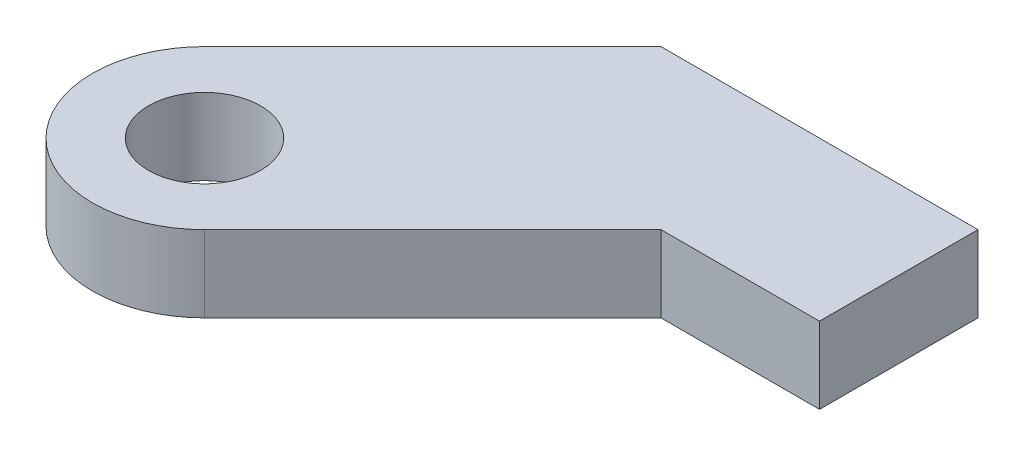
ISO-10303-21;
HEADER;
FILE_DESCRIPTION(('STEP AP214'),'2;1');
FILE_NAME('part.step','',(''),(''),'','','');
FILE_SCHEMA(('AUTOMOTIVE_DESIGN { 1 0 10303 214 1 1 1 1 }'));
ENDSEC;
DATA;
#1=APPLICATION_CONTEXT('core data for automotive mechanical design processes');
#2=APPLICATION_PROTOCOL_DEFINITION('international standard','automotive_design',2000,#1);
#3=PRODUCT_CONTEXT('',#1,'mechanical');
#4=PRODUCT('Part','Part','',(#3));
#5=PRODUCT_RELATED_PRODUCT_CATEGORY('part','',(#4));
#6=PRODUCT_DEFINITION_FORMATION('','',#4);
#7=PRODUCT_DEFINITION_CONTEXT('part definition',#1,'design');
#8=PRODUCT_DEFINITION('design','',#6,#7);
#9=PRODUCT_DEFINITION_SHAPE('','',#8);
#10=(LENGTH_UNIT() NAMED_UNIT(*) SI_UNIT(.MILLI.,.METRE.));
#11=(NAMED_UNIT(*) PLANE_ANGLE_UNIT() SI_UNIT($,.RADIAN.));
#12=(NAMED_UNIT(*) SI_UNIT($,.STERADIAN.) SOLID_ANGLE_UNIT());
#13=UNCERTAINTY_MEASURE_WITH_UNIT(LENGTH_MEASURE(1.E-05),#10,'distance_accuracy_value','');
#14=(GEOMETRIC_REPRESENTATION_CONTEXT(3) GLOBAL_UNCERTAINTY_ASSIGNED_CONTEXT((#13)) GLOBAL_UNIT_ASSIGNED_CONTEXT((#10,
#11,#12)) REPRESENTATION_CONTEXT('',''));
#15=CARTESIAN_POINT('',(0.,0.,0.));
#16=DIRECTION('',(0.,0.,1.));
#17=DIRECTION('',(1.,0.,0.));
#18=AXIS2_PLACEMENT_3D('',#15,#16,#17);
#19=CARTESIAN_POINT('',(-4.49719912834644,1.5,4.49719912834644));
#20=DIRECTION('',(0.,1.,0.));
#21=DIRECTION('',(0.,0.,1.));
#22=AXIS2_PLACEMENT_3D('',#19,#20,#21);
#23=PLANE('',#22);
#24=DIRECTION('',(-1.,0.,0.));
#25=VECTOR('',#24,1.);
#26=CARTESIAN_POINT('',(1.53795724908074,1.5,-1.53795724908074));
#27=LINE('',#26,#25);
#28=CARTESIAN_POINT('',(4.64922708630155,1.5,-1.53795724908074));
#29=VERTEX_POINT('',#28);
#30=CARTESIAN_POINT('',(-1.57331258814007,1.5,-1.53795724908074));
#31=VERTEX_POINT('',#30);
#32=EDGE_CURVE('E51',#29,#31,#27,.T.);
#33=ORIENTED_EDGE('',*,*,#32,.T.);
#34=DIRECTION('',(-0.707106781186547,0.,0.707106781186548));
#35=VECTOR('',#34,1.);
#36=CARTESIAN_POINT('',(-1.57331258814007,1.5,-1.53795724908074));
#37=LINE('',#36,#35);
#38=CARTESIAN_POINT('',(-6.05283404695685,1.5,2.94156420973604));
#39=VERTEX_POINT('',#38);
#40=EDGE_CURVE('E89',#31,#39,#37,.T.);
#41=ORIENTED_EDGE('',*,*,#40,.T.);
#42=CARTESIAN_POINT('',(-4.49719912834644,1.5,4.49719912834644));
#43=DIRECTION('',(0.,1.,0.));
#44=DIRECTION('',(0.,0.,1.));
#45=AXIS2_PLACEMENT_3D('',#42,#43,#44);
#46=CIRCLE('',#45,2.2);
#47=CARTESIAN_POINT('',(-2.94156420973604,1.5,6.05283404695685));
#48=VERTEX_POINT('',#47);
#49=EDGE_CURVE('E103',#39,#48,#46,.T.);
#50=ORIENTED_EDGE('',*,*,#49,.T.);
#51=DIRECTION('',(0.707106781186548,0.,-0.707106781186547));
#52=VECTOR('',#51,1.);
#53=CARTESIAN_POINT('',(1.53795724908074,1.5,1.57331258814007));
#54=LINE('',#53,#52);
#55=CARTESIAN_POINT('',(1.53795724908074,1.5,1.57331258814007));
#56=VERTEX_POINT('',#55);
#57=EDGE_CURVE('E97',#48,#56,#54,.T.);
#58=ORIENTED_EDGE('',*,*,#57,.T.);
#59=DIRECTION('',(1.,0.,0.));
#60=VECTOR('',#59,1.);
#61=CARTESIAN_POINT('',(1.53795724908074,1.5,1.57331258814007));
#62=LINE('',#61,#60);
#63=CARTESIAN_POINT('',(4.64922708630155,1.5,1.57331258814007));
#64=VERTEX_POINT('',#63);
#65=EDGE_CURVE('E101',#56,#64,#62,.T.);
#66=ORIENTED_EDGE('',*,*,#65,.T.);
#67=DIRECTION('',(0.,0.,-1.));
#68=VECTOR('',#67,1.);
#69=CARTESIAN_POINT('',(4.64922708630155,1.5,-1.53795724908074));
#70=LINE('',#69,#68);
#71=EDGE_CURVE('E117',#64,#29,#70,.T.);
#72=ORIENTED_EDGE('',*,*,#71,.T.);
#73=EDGE_LOOP('',(#33,#41,#50,#58,#66,#72));
#74=FACE_BOUND('',#73,.T.);
#75=CARTESIAN_POINT('',(-4.49719912834644,1.5,4.49719912834644));
#76=DIRECTION('',(0.,1.,0.));
#77=DIRECTION('',(0.,0.,1.));
#78=AXIS2_PLACEMENT_3D('',#75,#76,#77);
#79=CIRCLE('',#78,1.1);
#80=CARTESIAN_POINT('',(-4.49719912834644,1.5,5.59719912834644));
#81=VERTEX_POINT('',#80);
#82=EDGE_CURVE('E126',#81,#81,#79,.T.);
#83=ORIENTED_EDGE('',*,*,#82,.F.);
#84=EDGE_LOOP('',(#83));
#85=FACE_BOUND('',#84,.T.);
#86=ADVANCED_FACE('F34',(#74,#85),#23,.T.);
#87=CARTESIAN_POINT('',(-4.49719912834644,0.,4.49719912834644));
#88=DIRECTION('',(0.,1.,0.));
#89=DIRECTION('',(0.,0.,1.));
#90=AXIS2_PLACEMENT_3D('',#87,#88,#89);
#91=PLANE('',#90);
#92=DIRECTION('',(-0.707106781186547,0.,0.707106781186548));
#93=VECTOR('',#92,1.);
#94=CARTESIAN_POINT('',(-1.57331258814007,0.,-1.53795724908074));
#95=LINE('',#94,#93);
#96=CARTESIAN_POINT('',(-1.57331258814007,0.,-1.53795724908074));
#97=VERTEX_POINT('',#96);
#98=CARTESIAN_POINT('',(-6.05283404695685,0.,2.94156420973604));
#99=VERTEX_POINT('',#98);
#100=EDGE_CURVE('E123',#97,#99,#95,.T.);
#101=ORIENTED_EDGE('',*,*,#100,.F.);
#102=DIRECTION('',(-1.,0.,0.));
#103=VECTOR('',#102,1.);
#104=CARTESIAN_POINT('',(1.53795724908074,0.,-1.53795724908074));
#105=LINE('',#104,#103);
#106=CARTESIAN_POINT('',(4.64922708630155,0.,-1.53795724908074));
#107=VERTEX_POINT('',#106);
#108=EDGE_CURVE('E131',#107,#97,#105,.T.);
#109=ORIENTED_EDGE('',*,*,#108,.F.);
#110=DIRECTION('',(0.,0.,-1.));
#111=VECTOR('',#110,1.);
#112=CARTESIAN_POINT('',(4.64922708630155,0.,-1.53795724908074));
#113=LINE('',#112,#111);
#114=CARTESIAN_POINT('',(4.64922708630155,0.,1.57331258814007));
#115=VERTEX_POINT('',#114);
#116=EDGE_CURVE('E82',#115,#107,#113,.T.);
#117=ORIENTED_EDGE('',*,*,#116,.F.);
#118=DIRECTION('',(1.,0.,0.));
#119=VECTOR('',#118,1.);
#120=CARTESIAN_POINT('',(1.53795724908074,0.,1.57331258814007));
#121=LINE('',#120,#119);
#122=CARTESIAN_POINT('',(1.53795724908074,0.,1.57331258814007));
#123=VERTEX_POINT('',#122);
#124=EDGE_CURVE('E75',#123,#115,#121,.T.);
#125=ORIENTED_EDGE('',*,*,#124,.F.);
#126=DIRECTION('',(0.707106781186548,0.,-0.707106781186547));
#127=VECTOR('',#126,1.);
#128=CARTESIAN_POINT('',(1.53795724908074,0.,1.57331258814007));
#129=LINE('',#128,#127);
#130=CARTESIAN_POINT('',(-2.94156420973604,0.,6.05283404695685));
#131=VERTEX_POINT('',#130);
#132=EDGE_CURVE('E111',#131,#123,#129,.T.);
#133=ORIENTED_EDGE('',*,*,#132,.F.);
#134=CARTESIAN_POINT('',(-4.49719912834644,0.,4.49719912834644));
#135=DIRECTION('',(0.,1.,0.));
#136=DIRECTION('',(0.,0.,1.));
#137=AXIS2_PLACEMENT_3D('',#134,#135,#136);
#138=CIRCLE('',#137,2.2);
#139=EDGE_CURVE('E125',#99,#131,#138,.T.);
#140=ORIENTED_EDGE('',*,*,#139,.F.);
#141=EDGE_LOOP('',(#101,#109,#117,#125,#133,#140));
#142=FACE_BOUND('',#141,.T.);
#143=CARTESIAN_POINT('',(-4.49719912834644,0.,4.49719912834644));
#144=DIRECTION('',(0.,1.,0.));
#145=DIRECTION('',(0.,0.,1.));
#146=AXIS2_PLACEMENT_3D('',#143,#144,#145);
#147=CIRCLE('',#146,1.1);
#148=CARTESIAN_POINT('',(-4.49719912834644,0.,5.59719912834644));
#149=VERTEX_POINT('',#148);
#150=EDGE_CURVE('E149',#149,#149,#147,.T.);
#151=ORIENTED_EDGE('',*,*,#150,.T.);
#152=EDGE_LOOP('',(#151));
#153=FACE_BOUND('',#152,.T.);
#154=ADVANCED_FACE('F141',(#142,#153),#91,.F.);
#155=CARTESIAN_POINT('',(-1.57331258814007,1.5,-1.53795724908074));
#156=DIRECTION('',(0.707106781186548,0.,0.707106781186547));
#157=DIRECTION('',(0.707106781186547,0.,-0.707106781186548));
#158=AXIS2_PLACEMENT_3D('',#155,#156,#157);
#159=PLANE('',#158);
#160=ORIENTED_EDGE('',*,*,#100,.T.);
#161=DIRECTION('',(0.,-1.,0.));
#162=VECTOR('',#161,1.);
#163=CARTESIAN_POINT('',(-6.05283404695685,1.5,2.94156420973604));
#164=LINE('',#163,#162);
#165=EDGE_CURVE('E43',#39,#99,#164,.T.);
#166=ORIENTED_EDGE('',*,*,#165,.F.);
#167=ORIENTED_EDGE('',*,*,#40,.F.);
#168=DIRECTION('',(0.,-1.,0.));
#169=VECTOR('',#168,1.);
#170=CARTESIAN_POINT('',(-1.57331258814007,1.5,-1.53795724908074));
#171=LINE('',#170,#169);
#172=EDGE_CURVE('E11',#31,#97,#171,.T.);
#173=ORIENTED_EDGE('',*,*,#172,.T.);
#174=EDGE_LOOP('',(#160,#166,#167,#173));
#175=FACE_BOUND('',#174,.T.);
#176=ADVANCED_FACE('F36',(#175),#159,.F.);
#177=CARTESIAN_POINT('',(-4.49719912834644,1.5,4.49719912834644));
#178=DIRECTION('',(0.,-1.,0.));
#179=DIRECTION('',(0.,0.,-1.));
#180=AXIS2_PLACEMENT_3D('',#177,#178,#179);
#181=CYLINDRICAL_SURFACE('',#180,2.2);
#182=ORIENTED_EDGE('',*,*,#139,.T.);
#183=DIRECTION('',(0.,-1.,0.));
#184=VECTOR('',#183,1.);
#185=CARTESIAN_POINT('',(-2.94156420973604,1.5,6.05283404695685));
#186=LINE('',#185,#184);
#187=EDGE_CURVE('E112',#48,#131,#186,.T.);
#188=ORIENTED_EDGE('',*,*,#187,.F.);
#189=ORIENTED_EDGE('',*,*,#49,.F.);
#190=ORIENTED_EDGE('',*,*,#165,.T.);
#191=EDGE_LOOP('',(#182,#188,#189,#190));
#192=FACE_BOUND('',#191,.T.);
#193=ADVANCED_FACE('F138',(#192),#181,.T.);
#194=CARTESIAN_POINT('',(1.53795724908074,1.5,1.57331258814007));
#195=DIRECTION('',(-0.707106781186547,0.,-0.707106781186548));
#196=DIRECTION('',(-0.707106781186548,0.,0.707106781186547));
#197=AXIS2_PLACEMENT_3D('',#194,#195,#196);
#198=PLANE('',#197);
#199=ORIENTED_EDGE('',*,*,#132,.T.);
#200=DIRECTION('',(0.,-1.,0.));
#201=VECTOR('',#200,1.);
#202=CARTESIAN_POINT('',(1.53795724908074,1.5,1.57331258814007));
#203=LINE('',#202,#201);
#204=EDGE_CURVE('E108',#56,#123,#203,.T.);
#205=ORIENTED_EDGE('',*,*,#204,.F.);
#206=ORIENTED_EDGE('',*,*,#57,.F.);
#207=ORIENTED_EDGE('',*,*,#187,.T.);
#208=EDGE_LOOP('',(#199,#205,#206,#207));
#209=FACE_BOUND('',#208,.T.);
#210=ADVANCED_FACE('F109',(#209),#198,.F.);
#211=CARTESIAN_POINT('',(1.53795724908074,1.5,1.57331258814007));
#212=DIRECTION('',(0.,0.,-1.));
#213=DIRECTION('',(-1.,0.,0.));
#214=AXIS2_PLACEMENT_3D('',#211,#212,#213);
#215=PLANE('',#214);
#216=ORIENTED_EDGE('',*,*,#124,.T.);
#217=DIRECTION('',(0.,-1.,0.));
#218=VECTOR('',#217,1.);
#219=CARTESIAN_POINT('',(4.64922708630155,1.5,1.57331258814007));
#220=LINE('',#219,#218);
#221=EDGE_CURVE('E113',#64,#115,#220,.T.);
#222=ORIENTED_EDGE('',*,*,#221,.F.);
#223=ORIENTED_EDGE('',*,*,#65,.F.);
#224=ORIENTED_EDGE('',*,*,#204,.T.);
#225=EDGE_LOOP('',(#216,#222,#223,#224));
#226=FACE_BOUND('',#225,.T.);
#227=ADVANCED_FACE('F115',(#226),#215,.F.);
#228=CARTESIAN_POINT('',(4.64922708630155,1.5,-1.53795724908074));
#229=DIRECTION('',(-1.,0.,0.));
#230=DIRECTION('',(0.,0.,1.));
#231=AXIS2_PLACEMENT_3D('',#228,#229,#230);
#232=PLANE('',#231);
#233=ORIENTED_EDGE('',*,*,#116,.T.);
#234=DIRECTION('',(0.,-1.,0.));
#235=VECTOR('',#234,1.);
#236=CARTESIAN_POINT('',(4.64922708630155,1.5,-1.53795724908074));
#237=LINE('',#236,#235);
#238=EDGE_CURVE('E119',#29,#107,#237,.T.);
#239=ORIENTED_EDGE('',*,*,#238,.F.);
#240=ORIENTED_EDGE('',*,*,#71,.F.);
#241=ORIENTED_EDGE('',*,*,#221,.T.);
#242=EDGE_LOOP('',(#233,#239,#240,#241));
#243=FACE_BOUND('',#242,.T.);
#244=ADVANCED_FACE('F145',(#243),#232,.F.);
#245=CARTESIAN_POINT('',(1.53795724908074,1.5,-1.53795724908074));
#246=DIRECTION('',(0.,0.,1.));
#247=DIRECTION('',(1.,0.,0.));
#248=AXIS2_PLACEMENT_3D('',#245,#246,#247);
#249=PLANE('',#248);
#250=ORIENTED_EDGE('',*,*,#108,.T.);
#251=ORIENTED_EDGE('',*,*,#172,.F.);
#252=ORIENTED_EDGE('',*,*,#32,.F.);
#253=ORIENTED_EDGE('',*,*,#238,.T.);
#254=EDGE_LOOP('',(#250,#251,#252,#253));
#255=FACE_BOUND('',#254,.T.);
#256=ADVANCED_FACE('F144',(#255),#249,.F.);
#257=CARTESIAN_POINT('',(-4.49719912834644,1.5,4.49719912834644));
#258=DIRECTION('',(0.,-1.,0.));
#259=DIRECTION('',(0.,0.,-1.));
#260=AXIS2_PLACEMENT_3D('',#257,#258,#259);
#261=CYLINDRICAL_SURFACE('',#260,1.1);
#262=ORIENTED_EDGE('',*,*,#82,.T.);
#263=EDGE_LOOP('',(#262));
#264=FACE_BOUND('',#263,.T.);
#265=ORIENTED_EDGE('',*,*,#150,.F.);
#266=EDGE_LOOP('',(#265));
#267=FACE_BOUND('',#266,.T.);
#268=ADVANCED_FACE('F155',(#264,#267),#261,.F.);
#269=CLOSED_SHELL('',(#86,#154,#176,#193,#210,#227,#244,#256,#268));
#270=MANIFOLD_SOLID_BREP('B2',#269);
#271=ADVANCED_BREP_SHAPE_REPRESENTATION('',(#18,#270),#14);
#272=SHAPE_DEFINITION_REPRESENTATION(#9,#271);
ENDSEC;
END-ISO-10303-21;
